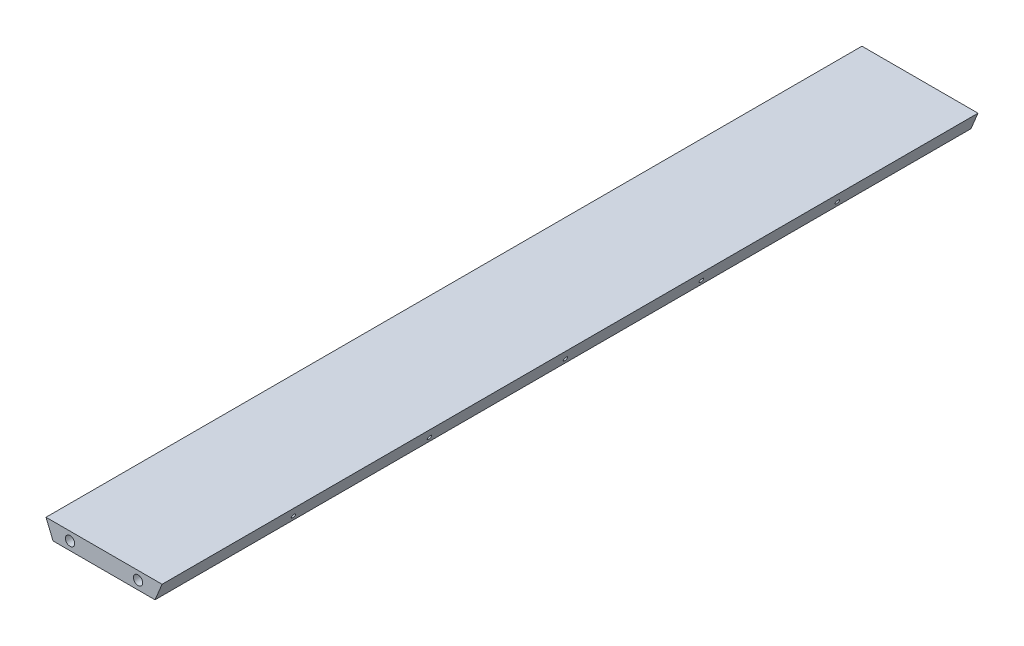
ISO-10303-21;
HEADER;
FILE_DESCRIPTION(('STEP AP214'),'2;1');
FILE_NAME('part.step','',(''),(''),'','','');
FILE_SCHEMA(('AUTOMOTIVE_DESIGN { 1 0 10303 214 1 1 1 1 }'));
ENDSEC;
DATA;
#1=APPLICATION_CONTEXT('core data for automotive mechanical design processes');
#2=APPLICATION_PROTOCOL_DEFINITION('international standard','automotive_design',2000,#1);
#3=PRODUCT_CONTEXT('',#1,'mechanical');
#4=PRODUCT('Part','Part','',(#3));
#5=PRODUCT_RELATED_PRODUCT_CATEGORY('part','',(#4));
#6=PRODUCT_DEFINITION_FORMATION('','',#4);
#7=PRODUCT_DEFINITION_CONTEXT('part definition',#1,'design');
#8=PRODUCT_DEFINITION('design','',#6,#7);
#9=PRODUCT_DEFINITION_SHAPE('','',#8);
#10=(LENGTH_UNIT() NAMED_UNIT(*) SI_UNIT(.MILLI.,.METRE.));
#11=(NAMED_UNIT(*) PLANE_ANGLE_UNIT() SI_UNIT($,.RADIAN.));
#12=(NAMED_UNIT(*) SI_UNIT($,.STERADIAN.) SOLID_ANGLE_UNIT());
#13=UNCERTAINTY_MEASURE_WITH_UNIT(LENGTH_MEASURE(1.E-05),#10,'distance_accuracy_value','');
#14=(GEOMETRIC_REPRESENTATION_CONTEXT(3) GLOBAL_UNCERTAINTY_ASSIGNED_CONTEXT((#13)) GLOBAL_UNIT_ASSIGNED_CONTEXT((#10,
#11,#12)) REPRESENTATION_CONTEXT('',''));
#15=CARTESIAN_POINT('',(0.,0.,0.));
#16=DIRECTION('',(0.,0.,1.));
#17=DIRECTION('',(1.,0.,0.));
#18=AXIS2_PLACEMENT_3D('',#15,#16,#17);
#19=CARTESIAN_POINT('',(19.05,45.9907683632075,304.8));
#20=DIRECTION('',(0.,1.,0.));
#21=DIRECTION('',(0.,0.,1.));
#22=AXIS2_PLACEMENT_3D('',#19,#20,#21);
#23=PLANE('',#22);
#24=DIRECTION('',(1.,0.,0.));
#25=VECTOR('',#24,1.);
#26=CARTESIAN_POINT('',(19.05,45.9907683632075,0.));
#27=LINE('',#26,#25);
#28=CARTESIAN_POINT('',(-19.05,45.9907683632075,0.));
#29=VERTEX_POINT('',#28);
#30=CARTESIAN_POINT('',(19.05,45.9907683632075,0.));
#31=VERTEX_POINT('',#30);
#32=EDGE_CURVE('E127',#29,#31,#27,.T.);
#33=ORIENTED_EDGE('',*,*,#32,.T.);
#34=DIRECTION('',(0.,0.,-1.));
#35=VECTOR('',#34,1.);
#36=CARTESIAN_POINT('',(19.05,45.9907683632075,304.8));
#37=LINE('',#36,#35);
#38=CARTESIAN_POINT('',(19.05,45.9907683632075,304.8));
#39=VERTEX_POINT('',#38);
#40=EDGE_CURVE('E11',#39,#31,#37,.T.);
#41=ORIENTED_EDGE('',*,*,#40,.F.);
#42=DIRECTION('',(1.,0.,0.));
#43=VECTOR('',#42,1.);
#44=CARTESIAN_POINT('',(19.05,45.9907683632075,304.8));
#45=LINE('',#44,#43);
#46=CARTESIAN_POINT('',(-19.05,45.9907683632075,304.8));
#47=VERTEX_POINT('',#46);
#48=EDGE_CURVE('E128',#47,#39,#45,.T.);
#49=ORIENTED_EDGE('',*,*,#48,.F.);
#50=DIRECTION('',(0.,0.,-1.));
#51=VECTOR('',#50,1.);
#52=CARTESIAN_POINT('',(-19.05,45.9907683632075,304.8));
#53=LINE('',#52,#51);
#54=EDGE_CURVE('E134',#47,#29,#53,.T.);
#55=ORIENTED_EDGE('',*,*,#54,.T.);
#56=EDGE_LOOP('',(#33,#41,#49,#55));
#57=FACE_BOUND('',#56,.T.);
#58=ADVANCED_FACE('F32',(#57),#23,.F.);
#59=CARTESIAN_POINT('',(21.6802561210692,52.3407683632075,304.8));
#60=DIRECTION('',(-0.923879532511287,0.38268343236509,0.));
#61=DIRECTION('',(-0.38268343236509,-0.923879532511287,0.));
#62=AXIS2_PLACEMENT_3D('',#59,#60,#61);
#63=PLANE('',#62);
#64=CARTESIAN_POINT('',(19.9612649233194,48.1907564999999,50.8));
#65=DIRECTION('',(0.923879532511287,-0.38268343236509,0.));
#66=DIRECTION('',(0.38268343236509,0.923879532511287,0.));
#67=AXIS2_PLACEMENT_3D('',#64,#65,#66);
#68=CIRCLE('',#67,0.79374999999992);
#69=CARTESIAN_POINT('',(20.2650198977592,48.9240858789307,50.8));
#70=VERTEX_POINT('',#69);
#71=EDGE_CURVE('E177',#70,#70,#68,.T.);
#72=ORIENTED_EDGE('',*,*,#71,.F.);
#73=EDGE_LOOP('',(#72));
#74=FACE_BOUND('',#73,.T.);
#75=CARTESIAN_POINT('',(19.9612649233194,48.1907564999999,101.6));
#76=DIRECTION('',(0.923879532511287,-0.38268343236509,0.));
#77=DIRECTION('',(0.38268343236509,0.923879532511287,0.));
#78=AXIS2_PLACEMENT_3D('',#75,#76,#77);
#79=CIRCLE('',#78,0.793749999999904);
#80=CARTESIAN_POINT('',(20.2650198977591,48.9240858789307,101.6));
#81=VERTEX_POINT('',#80);
#82=EDGE_CURVE('E181',#81,#81,#79,.T.);
#83=ORIENTED_EDGE('',*,*,#82,.F.);
#84=EDGE_LOOP('',(#83));
#85=FACE_BOUND('',#84,.T.);
#86=CARTESIAN_POINT('',(19.9612649233194,48.1907564999999,152.4));
#87=DIRECTION('',(0.923879532511287,-0.38268343236509,0.));
#88=DIRECTION('',(0.38268343236509,0.923879532511287,0.));
#89=AXIS2_PLACEMENT_3D('',#86,#87,#88);
#90=CIRCLE('',#89,0.793749999999904);
#91=CARTESIAN_POINT('',(20.2650198977591,48.9240858789307,152.4));
#92=VERTEX_POINT('',#91);
#93=EDGE_CURVE('E185',#92,#92,#90,.T.);
#94=ORIENTED_EDGE('',*,*,#93,.F.);
#95=EDGE_LOOP('',(#94));
#96=FACE_BOUND('',#95,.T.);
#97=CARTESIAN_POINT('',(19.9612649233194,48.1907564999999,203.2));
#98=DIRECTION('',(0.923879532511287,-0.38268343236509,0.));
#99=DIRECTION('',(0.38268343236509,0.923879532511287,0.));
#100=AXIS2_PLACEMENT_3D('',#97,#98,#99);
#101=CIRCLE('',#100,0.793749999999906);
#102=CARTESIAN_POINT('',(20.2650198977591,48.9240858789307,203.2));
#103=VERTEX_POINT('',#102);
#104=EDGE_CURVE('E189',#103,#103,#101,.T.);
#105=ORIENTED_EDGE('',*,*,#104,.F.);
#106=EDGE_LOOP('',(#105));
#107=FACE_BOUND('',#106,.T.);
#108=CARTESIAN_POINT('',(19.9612649233194,48.1907564999999,254.));
#109=DIRECTION('',(0.923879532511287,-0.38268343236509,0.));
#110=DIRECTION('',(0.38268343236509,0.923879532511287,0.));
#111=AXIS2_PLACEMENT_3D('',#108,#109,#110);
#112=CIRCLE('',#111,0.793749999999908);
#113=CARTESIAN_POINT('',(20.2650198977591,48.9240858789307,254.));
#114=VERTEX_POINT('',#113);
#115=EDGE_CURVE('E192',#114,#114,#112,.T.);
#116=ORIENTED_EDGE('',*,*,#115,.F.);
#117=EDGE_LOOP('',(#116));
#118=FACE_BOUND('',#117,.T.);
#119=DIRECTION('',(0.38268343236509,0.923879532511287,0.));
#120=VECTOR('',#119,1.);
#121=CARTESIAN_POINT('',(21.6802561210692,52.3407683632075,0.));
#122=LINE('',#121,#120);
#123=CARTESIAN_POINT('',(21.6802561210692,52.3407683632075,0.));
#124=VERTEX_POINT('',#123);
#125=EDGE_CURVE('E137',#31,#124,#122,.T.);
#126=ORIENTED_EDGE('',*,*,#125,.T.);
#127=DIRECTION('',(0.,0.,-1.));
#128=VECTOR('',#127,1.);
#129=CARTESIAN_POINT('',(21.6802561210692,52.3407683632075,304.8));
#130=LINE('',#129,#128);
#131=CARTESIAN_POINT('',(21.6802561210692,52.3407683632075,304.8));
#132=VERTEX_POINT('',#131);
#133=EDGE_CURVE('E40',#132,#124,#130,.T.);
#134=ORIENTED_EDGE('',*,*,#133,.F.);
#135=DIRECTION('',(0.38268343236509,0.923879532511287,0.));
#136=VECTOR('',#135,1.);
#137=CARTESIAN_POINT('',(21.6802561210692,52.3407683632075,304.8));
#138=LINE('',#137,#136);
#139=EDGE_CURVE('E79',#39,#132,#138,.T.);
#140=ORIENTED_EDGE('',*,*,#139,.F.);
#141=ORIENTED_EDGE('',*,*,#40,.T.);
#142=EDGE_LOOP('',(#126,#134,#140,#141));
#143=FACE_BOUND('',#142,.T.);
#144=ADVANCED_FACE('F162',(#74,#85,#96,#107,#118,#143),#63,.F.);
#145=CARTESIAN_POINT('',(-21.6802561210692,52.3407683632075,304.8));
#146=DIRECTION('',(0.,-1.,0.));
#147=DIRECTION('',(1.,0.,0.));
#148=AXIS2_PLACEMENT_3D('',#145,#146,#147);
#149=PLANE('',#148);
#150=DIRECTION('',(-1.,0.,0.));
#151=VECTOR('',#150,1.);
#152=CARTESIAN_POINT('',(-21.6802561210692,52.3407683632075,0.));
#153=LINE('',#152,#151);
#154=CARTESIAN_POINT('',(-21.6802561210692,52.3407683632075,0.));
#155=VERTEX_POINT('',#154);
#156=EDGE_CURVE('E66',#124,#155,#153,.T.);
#157=ORIENTED_EDGE('',*,*,#156,.T.);
#158=DIRECTION('',(0.,0.,-1.));
#159=VECTOR('',#158,1.);
#160=CARTESIAN_POINT('',(-21.6802561210692,52.3407683632075,304.8));
#161=LINE('',#160,#159);
#162=CARTESIAN_POINT('',(-21.6802561210692,52.3407683632075,304.8));
#163=VERTEX_POINT('',#162);
#164=EDGE_CURVE('E142',#163,#155,#161,.T.);
#165=ORIENTED_EDGE('',*,*,#164,.F.);
#166=DIRECTION('',(-1.,0.,0.));
#167=VECTOR('',#166,1.);
#168=CARTESIAN_POINT('',(-21.6802561210692,52.3407683632075,304.8));
#169=LINE('',#168,#167);
#170=EDGE_CURVE('E131',#132,#163,#169,.T.);
#171=ORIENTED_EDGE('',*,*,#170,.F.);
#172=ORIENTED_EDGE('',*,*,#133,.T.);
#173=EDGE_LOOP('',(#157,#165,#171,#172));
#174=FACE_BOUND('',#173,.T.);
#175=ADVANCED_FACE('F144',(#174),#149,.F.);
#176=CARTESIAN_POINT('',(-19.05,45.9907683632075,304.8));
#177=DIRECTION('',(0.923879532511287,0.38268343236509,0.));
#178=DIRECTION('',(-0.38268343236509,0.923879532511287,0.));
#179=AXIS2_PLACEMENT_3D('',#176,#177,#178);
#180=PLANE('',#179);
#181=CARTESIAN_POINT('',(-19.9612649233194,48.1907564999999,50.8));
#182=DIRECTION('',(0.923879532511287,0.38268343236509,0.));
#183=DIRECTION('',(-0.38268343236509,0.923879532511287,0.));
#184=AXIS2_PLACEMENT_3D('',#181,#182,#183);
#185=CIRCLE('',#184,0.79374999999992);
#186=CARTESIAN_POINT('',(-20.2650198977592,48.9240858789307,50.8));
#187=VERTEX_POINT('',#186);
#188=EDGE_CURVE('E238',#187,#187,#185,.T.);
#189=ORIENTED_EDGE('',*,*,#188,.T.);
#190=EDGE_LOOP('',(#189));
#191=FACE_BOUND('',#190,.T.);
#192=CARTESIAN_POINT('',(-19.9612649233194,48.1907564999999,101.6));
#193=DIRECTION('',(0.923879532511287,0.38268343236509,0.));
#194=DIRECTION('',(-0.38268343236509,0.923879532511287,0.));
#195=AXIS2_PLACEMENT_3D('',#192,#193,#194);
#196=CIRCLE('',#195,0.793749999999904);
#197=CARTESIAN_POINT('',(-20.2650198977591,48.9240858789307,101.6));
#198=VERTEX_POINT('',#197);
#199=EDGE_CURVE('E232',#198,#198,#196,.T.);
#200=ORIENTED_EDGE('',*,*,#199,.T.);
#201=EDGE_LOOP('',(#200));
#202=FACE_BOUND('',#201,.T.);
#203=CARTESIAN_POINT('',(-19.9612649233194,48.1907564999999,152.4));
#204=DIRECTION('',(0.923879532511287,0.38268343236509,0.));
#205=DIRECTION('',(-0.38268343236509,0.923879532511287,0.));
#206=AXIS2_PLACEMENT_3D('',#203,#204,#205);
#207=CIRCLE('',#206,0.793749999999904);
#208=CARTESIAN_POINT('',(-20.2650198977591,48.9240858789307,152.4));
#209=VERTEX_POINT('',#208);
#210=EDGE_CURVE('E226',#209,#209,#207,.T.);
#211=ORIENTED_EDGE('',*,*,#210,.T.);
#212=EDGE_LOOP('',(#211));
#213=FACE_BOUND('',#212,.T.);
#214=CARTESIAN_POINT('',(-19.9612649233194,48.1907564999999,203.2));
#215=DIRECTION('',(0.923879532511287,0.38268343236509,0.));
#216=DIRECTION('',(-0.38268343236509,0.923879532511287,0.));
#217=AXIS2_PLACEMENT_3D('',#214,#215,#216);
#218=CIRCLE('',#217,0.793749999999906);
#219=CARTESIAN_POINT('',(-20.2650198977591,48.9240858789307,203.2));
#220=VERTEX_POINT('',#219);
#221=EDGE_CURVE('E220',#220,#220,#218,.T.);
#222=ORIENTED_EDGE('',*,*,#221,.T.);
#223=EDGE_LOOP('',(#222));
#224=FACE_BOUND('',#223,.T.);
#225=CARTESIAN_POINT('',(-19.9612649233194,48.1907564999999,254.));
#226=DIRECTION('',(0.923879532511287,0.38268343236509,0.));
#227=DIRECTION('',(-0.38268343236509,0.923879532511287,0.));
#228=AXIS2_PLACEMENT_3D('',#225,#226,#227);
#229=CIRCLE('',#228,0.793749999999908);
#230=CARTESIAN_POINT('',(-20.2650198977591,48.9240858789307,254.));
#231=VERTEX_POINT('',#230);
#232=EDGE_CURVE('E214',#231,#231,#229,.T.);
#233=ORIENTED_EDGE('',*,*,#232,.T.);
#234=EDGE_LOOP('',(#233));
#235=FACE_BOUND('',#234,.T.);
#236=DIRECTION('',(0.38268343236509,-0.923879532511287,0.));
#237=VECTOR('',#236,1.);
#238=CARTESIAN_POINT('',(-19.05,45.9907683632075,0.));
#239=LINE('',#238,#237);
#240=EDGE_CURVE('E72',#155,#29,#239,.T.);
#241=ORIENTED_EDGE('',*,*,#240,.T.);
#242=ORIENTED_EDGE('',*,*,#54,.F.);
#243=DIRECTION('',(0.38268343236509,-0.923879532511287,0.));
#244=VECTOR('',#243,1.);
#245=CARTESIAN_POINT('',(-19.05,45.9907683632075,304.8));
#246=LINE('',#245,#244);
#247=EDGE_CURVE('E48',#163,#47,#246,.T.);
#248=ORIENTED_EDGE('',*,*,#247,.F.);
#249=ORIENTED_EDGE('',*,*,#164,.T.);
#250=EDGE_LOOP('',(#241,#242,#248,#249));
#251=FACE_BOUND('',#250,.T.);
#252=ADVANCED_FACE('F151',(#191,#202,#213,#224,#235,#251),#180,.F.);
#253=CARTESIAN_POINT('',(0.,0.,304.8));
#254=DIRECTION('',(0.,0.,-1.));
#255=DIRECTION('',(-1.,0.,0.));
#256=AXIS2_PLACEMENT_3D('',#253,#254,#255);
#257=PLANE('',#256);
#258=CARTESIAN_POINT('',(-12.7,49.1657683632075,304.8));
#259=DIRECTION('',(0.,0.,1.));
#260=DIRECTION('',(1.,0.,0.));
#261=AXIS2_PLACEMENT_3D('',#258,#259,#260);
#262=CIRCLE('',#261,1.72719999999999);
#263=CARTESIAN_POINT('',(-10.9728,49.1657683632075,304.8));
#264=VERTEX_POINT('',#263);
#265=EDGE_CURVE('E103',#264,#264,#262,.T.);
#266=ORIENTED_EDGE('',*,*,#265,.F.);
#267=EDGE_LOOP('',(#266));
#268=FACE_BOUND('',#267,.T.);
#269=CARTESIAN_POINT('',(12.7,49.1657683632075,304.8));
#270=DIRECTION('',(0.,0.,1.));
#271=DIRECTION('',(1.,0.,0.));
#272=AXIS2_PLACEMENT_3D('',#269,#270,#271);
#273=CIRCLE('',#272,1.72719999999999);
#274=CARTESIAN_POINT('',(14.4272,49.1657683632075,304.8));
#275=VERTEX_POINT('',#274);
#276=EDGE_CURVE('E102',#275,#275,#273,.T.);
#277=ORIENTED_EDGE('',*,*,#276,.F.);
#278=EDGE_LOOP('',(#277));
#279=FACE_BOUND('',#278,.T.);
#280=ORIENTED_EDGE('',*,*,#48,.T.);
#281=ORIENTED_EDGE('',*,*,#139,.T.);
#282=ORIENTED_EDGE('',*,*,#170,.T.);
#283=ORIENTED_EDGE('',*,*,#247,.T.);
#284=EDGE_LOOP('',(#280,#281,#282,#283));
#285=FACE_BOUND('',#284,.T.);
#286=ADVANCED_FACE('F153',(#268,#279,#285),#257,.F.);
#287=CARTESIAN_POINT('',(0.,0.,0.));
#288=DIRECTION('',(0.,0.,-1.));
#289=DIRECTION('',(-1.,0.,0.));
#290=AXIS2_PLACEMENT_3D('',#287,#288,#289);
#291=PLANE('',#290);
#292=CARTESIAN_POINT('',(-12.7,49.1657683632075,0.));
#293=DIRECTION('',(0.,0.,-1.));
#294=DIRECTION('',(-1.,0.,0.));
#295=AXIS2_PLACEMENT_3D('',#292,#293,#294);
#296=CIRCLE('',#295,1.72719999999999);
#297=CARTESIAN_POINT('',(-14.4272,49.1657683632075,0.));
#298=VERTEX_POINT('',#297);
#299=EDGE_CURVE('E115',#298,#298,#296,.T.);
#300=ORIENTED_EDGE('',*,*,#299,.F.);
#301=EDGE_LOOP('',(#300));
#302=FACE_BOUND('',#301,.T.);
#303=CARTESIAN_POINT('',(12.7,49.1657683632075,0.));
#304=DIRECTION('',(0.,0.,-1.));
#305=DIRECTION('',(-1.,0.,0.));
#306=AXIS2_PLACEMENT_3D('',#303,#304,#305);
#307=CIRCLE('',#306,1.72719999999999);
#308=CARTESIAN_POINT('',(10.9728,49.1657683632075,0.));
#309=VERTEX_POINT('',#308);
#310=EDGE_CURVE('E121',#309,#309,#307,.T.);
#311=ORIENTED_EDGE('',*,*,#310,.F.);
#312=EDGE_LOOP('',(#311));
#313=FACE_BOUND('',#312,.T.);
#314=ORIENTED_EDGE('',*,*,#32,.F.);
#315=ORIENTED_EDGE('',*,*,#240,.F.);
#316=ORIENTED_EDGE('',*,*,#156,.F.);
#317=ORIENTED_EDGE('',*,*,#125,.F.);
#318=EDGE_LOOP('',(#314,#315,#316,#317));
#319=FACE_BOUND('',#318,.T.);
#320=ADVANCED_FACE('F147',(#302,#313,#319),#291,.T.);
#321=CARTESIAN_POINT('',(12.7,49.1657683632075,25.4));
#322=DIRECTION('',(0.,0.,-1.));
#323=DIRECTION('',(-1.,0.,0.));
#324=AXIS2_PLACEMENT_3D('',#321,#322,#323);
#325=CONICAL_SURFACE('',#324,1.7272,1.02974425867665);
#326=CARTESIAN_POINT('',(12.7,49.1657683632075,26.4378064611844));
#327=VERTEX_POINT('',#326);
#328=VERTEX_LOOP('',#327);
#329=FACE_BOUND('',#328,.T.);
#330=CARTESIAN_POINT('',(12.7,49.1657683632075,25.4));
#331=DIRECTION('',(0.,0.,-1.));
#332=DIRECTION('',(-1.,0.,0.));
#333=AXIS2_PLACEMENT_3D('',#330,#331,#332);
#334=CIRCLE('',#333,1.7272);
#335=CARTESIAN_POINT('',(10.9728,49.1657683632075,25.4));
#336=VERTEX_POINT('',#335);
#337=EDGE_CURVE('E124',#336,#336,#334,.T.);
#338=ORIENTED_EDGE('',*,*,#337,.T.);
#339=EDGE_LOOP('',(#338));
#340=FACE_BOUND('',#339,.T.);
#341=ADVANCED_FACE('F346',(#329,#340),#325,.F.);
#342=CARTESIAN_POINT('',(12.7,49.1657683632075,0.));
#343=DIRECTION('',(0.,0.,-1.));
#344=DIRECTION('',(-1.,0.,0.));
#345=AXIS2_PLACEMENT_3D('',#342,#343,#344);
#346=CYLINDRICAL_SURFACE('',#345,1.72719999999999);
#347=ORIENTED_EDGE('',*,*,#337,.F.);
#348=EDGE_LOOP('',(#347));
#349=FACE_BOUND('',#348,.T.);
#350=ORIENTED_EDGE('',*,*,#310,.T.);
#351=EDGE_LOOP('',(#350));
#352=FACE_BOUND('',#351,.T.);
#353=ADVANCED_FACE('F342',(#349,#352),#346,.F.);
#354=CARTESIAN_POINT('',(-12.7,49.1657683632075,25.4));
#355=DIRECTION('',(0.,0.,-1.));
#356=DIRECTION('',(-1.,0.,0.));
#357=AXIS2_PLACEMENT_3D('',#354,#355,#356);
#358=CONICAL_SURFACE('',#357,1.7272,1.02974425867665);
#359=CARTESIAN_POINT('',(-12.7,49.1657683632075,26.4378064611844));
#360=VERTEX_POINT('',#359);
#361=VERTEX_LOOP('',#360);
#362=FACE_BOUND('',#361,.T.);
#363=CARTESIAN_POINT('',(-12.7,49.1657683632075,25.4));
#364=DIRECTION('',(0.,0.,-1.));
#365=DIRECTION('',(-1.,0.,0.));
#366=AXIS2_PLACEMENT_3D('',#363,#364,#365);
#367=CIRCLE('',#366,1.7272);
#368=CARTESIAN_POINT('',(-14.4272,49.1657683632075,25.4));
#369=VERTEX_POINT('',#368);
#370=EDGE_CURVE('E118',#369,#369,#367,.T.);
#371=ORIENTED_EDGE('',*,*,#370,.T.);
#372=EDGE_LOOP('',(#371));
#373=FACE_BOUND('',#372,.T.);
#374=ADVANCED_FACE('F338',(#362,#373),#358,.F.);
#375=CARTESIAN_POINT('',(-12.7,49.1657683632075,0.));
#376=DIRECTION('',(0.,0.,-1.));
#377=DIRECTION('',(-1.,0.,0.));
#378=AXIS2_PLACEMENT_3D('',#375,#376,#377);
#379=CYLINDRICAL_SURFACE('',#378,1.72719999999999);
#380=ORIENTED_EDGE('',*,*,#370,.F.);
#381=EDGE_LOOP('',(#380));
#382=FACE_BOUND('',#381,.T.);
#383=ORIENTED_EDGE('',*,*,#299,.T.);
#384=EDGE_LOOP('',(#383));
#385=FACE_BOUND('',#384,.T.);
#386=ADVANCED_FACE('F334',(#382,#385),#379,.F.);
#387=CARTESIAN_POINT('',(12.7,49.1657683632075,279.4));
#388=DIRECTION('',(0.,0.,1.));
#389=DIRECTION('',(1.,0.,0.));
#390=AXIS2_PLACEMENT_3D('',#387,#388,#389);
#391=CONICAL_SURFACE('',#390,1.7272,1.02974425867665);
#392=CARTESIAN_POINT('',(12.7,49.1657683632075,278.362193538816));
#393=VERTEX_POINT('',#392);
#394=VERTEX_LOOP('',#393);
#395=FACE_BOUND('',#394,.T.);
#396=CARTESIAN_POINT('',(12.7,49.1657683632075,279.4));
#397=DIRECTION('',(0.,0.,1.));
#398=DIRECTION('',(1.,0.,0.));
#399=AXIS2_PLACEMENT_3D('',#396,#397,#398);
#400=CIRCLE('',#399,1.7272);
#401=CARTESIAN_POINT('',(14.4272,49.1657683632075,279.4));
#402=VERTEX_POINT('',#401);
#403=EDGE_CURVE('E106',#402,#402,#400,.T.);
#404=ORIENTED_EDGE('',*,*,#403,.T.);
#405=EDGE_LOOP('',(#404));
#406=FACE_BOUND('',#405,.T.);
#407=ADVANCED_FACE('F330',(#395,#406),#391,.F.);
#408=CARTESIAN_POINT('',(12.7,49.1657683632075,304.8));
#409=DIRECTION('',(0.,0.,1.));
#410=DIRECTION('',(1.,0.,0.));
#411=AXIS2_PLACEMENT_3D('',#408,#409,#410);
#412=CYLINDRICAL_SURFACE('',#411,1.72719999999999);
#413=ORIENTED_EDGE('',*,*,#403,.F.);
#414=EDGE_LOOP('',(#413));
#415=FACE_BOUND('',#414,.T.);
#416=ORIENTED_EDGE('',*,*,#276,.T.);
#417=EDGE_LOOP('',(#416));
#418=FACE_BOUND('',#417,.T.);
#419=ADVANCED_FACE('F96',(#415,#418),#412,.F.);
#420=CARTESIAN_POINT('',(-12.7,49.1657683632075,279.4));
#421=DIRECTION('',(0.,0.,1.));
#422=DIRECTION('',(1.,0.,0.));
#423=AXIS2_PLACEMENT_3D('',#420,#421,#422);
#424=CONICAL_SURFACE('',#423,1.7272,1.02974425867665);
#425=CARTESIAN_POINT('',(-12.7,49.1657683632075,278.362193538816));
#426=VERTEX_POINT('',#425);
#427=VERTEX_LOOP('',#426);
#428=FACE_BOUND('',#427,.T.);
#429=CARTESIAN_POINT('',(-12.7,49.1657683632075,279.4));
#430=DIRECTION('',(0.,0.,1.));
#431=DIRECTION('',(1.,0.,0.));
#432=AXIS2_PLACEMENT_3D('',#429,#430,#431);
#433=CIRCLE('',#432,1.7272);
#434=CARTESIAN_POINT('',(-10.9728,49.1657683632075,279.4));
#435=VERTEX_POINT('',#434);
#436=EDGE_CURVE('E100',#435,#435,#433,.T.);
#437=ORIENTED_EDGE('',*,*,#436,.T.);
#438=EDGE_LOOP('',(#437));
#439=FACE_BOUND('',#438,.T.);
#440=ADVANCED_FACE('F92',(#428,#439),#424,.F.);
#441=CARTESIAN_POINT('',(-12.7,49.1657683632075,304.8));
#442=DIRECTION('',(0.,0.,1.));
#443=DIRECTION('',(1.,0.,0.));
#444=AXIS2_PLACEMENT_3D('',#441,#442,#443);
#445=CYLINDRICAL_SURFACE('',#444,1.72719999999999);
#446=ORIENTED_EDGE('',*,*,#436,.F.);
#447=EDGE_LOOP('',(#446));
#448=FACE_BOUND('',#447,.T.);
#449=ORIENTED_EDGE('',*,*,#265,.T.);
#450=EDGE_LOOP('',(#449));
#451=FACE_BOUND('',#450,.T.);
#452=ADVANCED_FACE('F95',(#448,#451),#445,.F.);
#453=CARTESIAN_POINT('',(14.0946298918727,50.6207962955183,254.));
#454=DIRECTION('',(0.923879532511287,-0.38268343236509,0.));
#455=DIRECTION('',(0.38268343236509,0.923879532511287,0.));
#456=AXIS2_PLACEMENT_3D('',#453,#454,#455);
#457=CYLINDRICAL_SURFACE('',#456,0.793749999999908);
#458=CARTESIAN_POINT('',(14.0946298918727,50.6207962955183,254.));
#459=DIRECTION('',(0.923879532511287,-0.38268343236509,0.));
#460=DIRECTION('',(0.38268343236509,0.923879532511287,0.));
#461=AXIS2_PLACEMENT_3D('',#458,#459,#460);
#462=CIRCLE('',#461,0.793749999999908);
#463=CARTESIAN_POINT('',(14.3983848663124,51.354125674449,254.));
#464=VERTEX_POINT('',#463);
#465=EDGE_CURVE('E109',#464,#464,#462,.T.);
#466=ORIENTED_EDGE('',*,*,#465,.F.);
#467=EDGE_LOOP('',(#466));
#468=FACE_BOUND('',#467,.T.);
#469=ORIENTED_EDGE('',*,*,#115,.T.);
#470=EDGE_LOOP('',(#469));
#471=FACE_BOUND('',#470,.T.);
#472=ADVANCED_FACE('F321',(#468,#471),#457,.F.);
#473=CARTESIAN_POINT('',(14.0946298918727,50.6207962955183,254.));
#474=DIRECTION('',(0.923879532511287,-0.38268343236509,0.));
#475=DIRECTION('',(0.38268343236509,0.923879532511287,0.));
#476=AXIS2_PLACEMENT_3D('',#473,#474,#475);
#477=PLANE('',#476);
#478=ORIENTED_EDGE('',*,*,#465,.T.);
#479=EDGE_LOOP('',(#478));
#480=FACE_BOUND('',#479,.T.);
#481=ADVANCED_FACE('F317',(#480),#477,.T.);
#482=CARTESIAN_POINT('',(14.0946298918727,50.6207962955183,203.2));
#483=DIRECTION('',(0.923879532511287,-0.38268343236509,0.));
#484=DIRECTION('',(0.38268343236509,0.923879532511287,0.));
#485=AXIS2_PLACEMENT_3D('',#482,#483,#484);
#486=CYLINDRICAL_SURFACE('',#485,0.793749999999906);
#487=CARTESIAN_POINT('',(14.0946298918727,50.6207962955183,203.2));
#488=DIRECTION('',(0.923879532511287,-0.38268343236509,0.));
#489=DIRECTION('',(0.38268343236509,0.923879532511287,0.));
#490=AXIS2_PLACEMENT_3D('',#487,#488,#489);
#491=CIRCLE('',#490,0.793749999999906);
#492=CARTESIAN_POINT('',(14.3983848663124,51.354125674449,203.2));
#493=VERTEX_POINT('',#492);
#494=EDGE_CURVE('E194',#493,#493,#491,.T.);
#495=ORIENTED_EDGE('',*,*,#494,.F.);
#496=EDGE_LOOP('',(#495));
#497=FACE_BOUND('',#496,.T.);
#498=ORIENTED_EDGE('',*,*,#104,.T.);
#499=EDGE_LOOP('',(#498));
#500=FACE_BOUND('',#499,.T.);
#501=ADVANCED_FACE('F313',(#497,#500),#486,.F.);
#502=CARTESIAN_POINT('',(14.0946298918727,50.6207962955183,203.2));
#503=DIRECTION('',(0.923879532511287,-0.38268343236509,0.));
#504=DIRECTION('',(0.38268343236509,0.923879532511287,0.));
#505=AXIS2_PLACEMENT_3D('',#502,#503,#504);
#506=PLANE('',#505);
#507=ORIENTED_EDGE('',*,*,#494,.T.);
#508=EDGE_LOOP('',(#507));
#509=FACE_BOUND('',#508,.T.);
#510=ADVANCED_FACE('F309',(#509),#506,.T.);
#511=CARTESIAN_POINT('',(14.0946298918727,50.6207962955183,152.4));
#512=DIRECTION('',(0.923879532511287,-0.38268343236509,0.));
#513=DIRECTION('',(0.38268343236509,0.923879532511287,0.));
#514=AXIS2_PLACEMENT_3D('',#511,#512,#513);
#515=CYLINDRICAL_SURFACE('',#514,0.793749999999904);
#516=CARTESIAN_POINT('',(14.0946298918727,50.6207962955183,152.4));
#517=DIRECTION('',(0.923879532511287,-0.38268343236509,0.));
#518=DIRECTION('',(0.38268343236509,0.923879532511287,0.));
#519=AXIS2_PLACEMENT_3D('',#516,#517,#518);
#520=CIRCLE('',#519,0.793749999999904);
#521=CARTESIAN_POINT('',(14.3983848663124,51.354125674449,152.4));
#522=VERTEX_POINT('',#521);
#523=EDGE_CURVE('E200',#522,#522,#520,.T.);
#524=ORIENTED_EDGE('',*,*,#523,.F.);
#525=EDGE_LOOP('',(#524));
#526=FACE_BOUND('',#525,.T.);
#527=ORIENTED_EDGE('',*,*,#93,.T.);
#528=EDGE_LOOP('',(#527));
#529=FACE_BOUND('',#528,.T.);
#530=ADVANCED_FACE('F305',(#526,#529),#515,.F.);
#531=CARTESIAN_POINT('',(14.0946298918727,50.6207962955183,152.4));
#532=DIRECTION('',(0.923879532511287,-0.38268343236509,0.));
#533=DIRECTION('',(0.38268343236509,0.923879532511287,0.));
#534=AXIS2_PLACEMENT_3D('',#531,#532,#533);
#535=PLANE('',#534);
#536=ORIENTED_EDGE('',*,*,#523,.T.);
#537=EDGE_LOOP('',(#536));
#538=FACE_BOUND('',#537,.T.);
#539=ADVANCED_FACE('F301',(#538),#535,.T.);
#540=CARTESIAN_POINT('',(14.0946298918727,50.6207962955183,101.6));
#541=DIRECTION('',(0.923879532511287,-0.38268343236509,0.));
#542=DIRECTION('',(0.38268343236509,0.923879532511287,0.));
#543=AXIS2_PLACEMENT_3D('',#540,#541,#542);
#544=CYLINDRICAL_SURFACE('',#543,0.793749999999904);
#545=CARTESIAN_POINT('',(14.0946298918727,50.6207962955183,101.6));
#546=DIRECTION('',(0.923879532511287,-0.38268343236509,0.));
#547=DIRECTION('',(0.38268343236509,0.923879532511287,0.));
#548=AXIS2_PLACEMENT_3D('',#545,#546,#547);
#549=CIRCLE('',#548,0.793749999999904);
#550=CARTESIAN_POINT('',(14.3983848663124,51.354125674449,101.6));
#551=VERTEX_POINT('',#550);
#552=EDGE_CURVE('E203',#551,#551,#549,.T.);
#553=ORIENTED_EDGE('',*,*,#552,.F.);
#554=EDGE_LOOP('',(#553));
#555=FACE_BOUND('',#554,.T.);
#556=ORIENTED_EDGE('',*,*,#82,.T.);
#557=EDGE_LOOP('',(#556));
#558=FACE_BOUND('',#557,.T.);
#559=ADVANCED_FACE('F297',(#555,#558),#544,.F.);
#560=CARTESIAN_POINT('',(14.0946298918727,50.6207962955183,101.6));
#561=DIRECTION('',(0.923879532511287,-0.38268343236509,0.));
#562=DIRECTION('',(0.38268343236509,0.923879532511287,0.));
#563=AXIS2_PLACEMENT_3D('',#560,#561,#562);
#564=PLANE('',#563);
#565=ORIENTED_EDGE('',*,*,#552,.T.);
#566=EDGE_LOOP('',(#565));
#567=FACE_BOUND('',#566,.T.);
#568=ADVANCED_FACE('F293',(#567),#564,.T.);
#569=CARTESIAN_POINT('',(14.0946298918727,50.6207962955183,50.8));
#570=DIRECTION('',(0.923879532511287,-0.38268343236509,0.));
#571=DIRECTION('',(0.38268343236509,0.923879532511287,0.));
#572=AXIS2_PLACEMENT_3D('',#569,#570,#571);
#573=CYLINDRICAL_SURFACE('',#572,0.79374999999992);
#574=CARTESIAN_POINT('',(14.0946298918727,50.6207962955183,50.8));
#575=DIRECTION('',(0.923879532511287,-0.38268343236509,0.));
#576=DIRECTION('',(0.38268343236509,0.923879532511287,0.));
#577=AXIS2_PLACEMENT_3D('',#574,#575,#576);
#578=CIRCLE('',#577,0.79374999999992);
#579=CARTESIAN_POINT('',(14.3983848663125,51.354125674449,50.8));
#580=VERTEX_POINT('',#579);
#581=EDGE_CURVE('E207',#580,#580,#578,.T.);
#582=ORIENTED_EDGE('',*,*,#581,.F.);
#583=EDGE_LOOP('',(#582));
#584=FACE_BOUND('',#583,.T.);
#585=ORIENTED_EDGE('',*,*,#71,.T.);
#586=EDGE_LOOP('',(#585));
#587=FACE_BOUND('',#586,.T.);
#588=ADVANCED_FACE('F289',(#584,#587),#573,.F.);
#589=CARTESIAN_POINT('',(14.0946298918727,50.6207962955183,50.8));
#590=DIRECTION('',(0.923879532511287,-0.38268343236509,0.));
#591=DIRECTION('',(0.38268343236509,0.923879532511287,0.));
#592=AXIS2_PLACEMENT_3D('',#589,#590,#591);
#593=PLANE('',#592);
#594=ORIENTED_EDGE('',*,*,#581,.T.);
#595=EDGE_LOOP('',(#594));
#596=FACE_BOUND('',#595,.T.);
#597=ADVANCED_FACE('F285',(#596),#593,.T.);
#598=CARTESIAN_POINT('',(-14.0946298918727,50.6207962955183,254.));
#599=DIRECTION('',(-0.923879532511287,-0.38268343236509,0.));
#600=DIRECTION('',(0.38268343236509,-0.923879532511287,0.));
#601=AXIS2_PLACEMENT_3D('',#598,#599,#600);
#602=CYLINDRICAL_SURFACE('',#601,0.793749999999908);
#603=CARTESIAN_POINT('',(-14.0946298918727,50.6207962955183,254.));
#604=DIRECTION('',(0.923879532511287,0.38268343236509,0.));
#605=DIRECTION('',(-0.38268343236509,0.923879532511287,0.));
#606=AXIS2_PLACEMENT_3D('',#603,#604,#605);
#607=CIRCLE('',#606,0.793749999999908);
#608=CARTESIAN_POINT('',(-14.3983848663124,51.354125674449,254.));
#609=VERTEX_POINT('',#608);
#610=EDGE_CURVE('E211',#609,#609,#607,.T.);
#611=ORIENTED_EDGE('',*,*,#610,.T.);
#612=EDGE_LOOP('',(#611));
#613=FACE_BOUND('',#612,.T.);
#614=ORIENTED_EDGE('',*,*,#232,.F.);
#615=EDGE_LOOP('',(#614));
#616=FACE_BOUND('',#615,.T.);
#617=ADVANCED_FACE('F281',(#613,#616),#602,.F.);
#618=CARTESIAN_POINT('',(-14.0946298918727,50.6207962955183,254.));
#619=DIRECTION('',(-0.923879532511287,-0.38268343236509,0.));
#620=DIRECTION('',(-0.38268343236509,0.923879532511287,0.));
#621=AXIS2_PLACEMENT_3D('',#618,#619,#620);
#622=PLANE('',#621);
#623=ORIENTED_EDGE('',*,*,#610,.F.);
#624=EDGE_LOOP('',(#623));
#625=FACE_BOUND('',#624,.T.);
#626=ADVANCED_FACE('F277',(#625),#622,.T.);
#627=CARTESIAN_POINT('',(-14.0946298918727,50.6207962955183,203.2));
#628=DIRECTION('',(-0.923879532511287,-0.38268343236509,0.));
#629=DIRECTION('',(0.38268343236509,-0.923879532511287,0.));
#630=AXIS2_PLACEMENT_3D('',#627,#628,#629);
#631=CYLINDRICAL_SURFACE('',#630,0.793749999999906);
#632=CARTESIAN_POINT('',(-14.0946298918727,50.6207962955183,203.2));
#633=DIRECTION('',(0.923879532511287,0.38268343236509,0.));
#634=DIRECTION('',(-0.38268343236509,0.923879532511287,0.));
#635=AXIS2_PLACEMENT_3D('',#632,#633,#634);
#636=CIRCLE('',#635,0.793749999999906);
#637=CARTESIAN_POINT('',(-14.3983848663124,51.354125674449,203.2));
#638=VERTEX_POINT('',#637);
#639=EDGE_CURVE('E217',#638,#638,#636,.T.);
#640=ORIENTED_EDGE('',*,*,#639,.T.);
#641=EDGE_LOOP('',(#640));
#642=FACE_BOUND('',#641,.T.);
#643=ORIENTED_EDGE('',*,*,#221,.F.);
#644=EDGE_LOOP('',(#643));
#645=FACE_BOUND('',#644,.T.);
#646=ADVANCED_FACE('F273',(#642,#645),#631,.F.);
#647=CARTESIAN_POINT('',(-14.0946298918727,50.6207962955183,203.2));
#648=DIRECTION('',(-0.923879532511287,-0.38268343236509,0.));
#649=DIRECTION('',(-0.38268343236509,0.923879532511287,0.));
#650=AXIS2_PLACEMENT_3D('',#647,#648,#649);
#651=PLANE('',#650);
#652=ORIENTED_EDGE('',*,*,#639,.F.);
#653=EDGE_LOOP('',(#652));
#654=FACE_BOUND('',#653,.T.);
#655=ADVANCED_FACE('F269',(#654),#651,.T.);
#656=CARTESIAN_POINT('',(-14.0946298918727,50.6207962955183,152.4));
#657=DIRECTION('',(-0.923879532511287,-0.38268343236509,0.));
#658=DIRECTION('',(0.38268343236509,-0.923879532511287,0.));
#659=AXIS2_PLACEMENT_3D('',#656,#657,#658);
#660=CYLINDRICAL_SURFACE('',#659,0.793749999999904);
#661=CARTESIAN_POINT('',(-14.0946298918727,50.6207962955183,152.4));
#662=DIRECTION('',(0.923879532511287,0.38268343236509,0.));
#663=DIRECTION('',(-0.38268343236509,0.923879532511287,0.));
#664=AXIS2_PLACEMENT_3D('',#661,#662,#663);
#665=CIRCLE('',#664,0.793749999999904);
#666=CARTESIAN_POINT('',(-14.3983848663124,51.354125674449,152.4));
#667=VERTEX_POINT('',#666);
#668=EDGE_CURVE('E223',#667,#667,#665,.T.);
#669=ORIENTED_EDGE('',*,*,#668,.T.);
#670=EDGE_LOOP('',(#669));
#671=FACE_BOUND('',#670,.T.);
#672=ORIENTED_EDGE('',*,*,#210,.F.);
#673=EDGE_LOOP('',(#672));
#674=FACE_BOUND('',#673,.T.);
#675=ADVANCED_FACE('F265',(#671,#674),#660,.F.);
#676=CARTESIAN_POINT('',(-14.0946298918727,50.6207962955183,152.4));
#677=DIRECTION('',(-0.923879532511287,-0.38268343236509,0.));
#678=DIRECTION('',(-0.38268343236509,0.923879532511287,0.));
#679=AXIS2_PLACEMENT_3D('',#676,#677,#678);
#680=PLANE('',#679);
#681=ORIENTED_EDGE('',*,*,#668,.F.);
#682=EDGE_LOOP('',(#681));
#683=FACE_BOUND('',#682,.T.);
#684=ADVANCED_FACE('F261',(#683),#680,.T.);
#685=CARTESIAN_POINT('',(-14.0946298918727,50.6207962955183,101.6));
#686=DIRECTION('',(-0.923879532511287,-0.38268343236509,0.));
#687=DIRECTION('',(0.38268343236509,-0.923879532511287,0.));
#688=AXIS2_PLACEMENT_3D('',#685,#686,#687);
#689=CYLINDRICAL_SURFACE('',#688,0.793749999999904);
#690=CARTESIAN_POINT('',(-14.0946298918727,50.6207962955183,101.6));
#691=DIRECTION('',(0.923879532511287,0.38268343236509,0.));
#692=DIRECTION('',(-0.38268343236509,0.923879532511287,0.));
#693=AXIS2_PLACEMENT_3D('',#690,#691,#692);
#694=CIRCLE('',#693,0.793749999999904);
#695=CARTESIAN_POINT('',(-14.3983848663124,51.354125674449,101.6));
#696=VERTEX_POINT('',#695);
#697=EDGE_CURVE('E229',#696,#696,#694,.T.);
#698=ORIENTED_EDGE('',*,*,#697,.T.);
#699=EDGE_LOOP('',(#698));
#700=FACE_BOUND('',#699,.T.);
#701=ORIENTED_EDGE('',*,*,#199,.F.);
#702=EDGE_LOOP('',(#701));
#703=FACE_BOUND('',#702,.T.);
#704=ADVANCED_FACE('F257',(#700,#703),#689,.F.);
#705=CARTESIAN_POINT('',(-14.0946298918727,50.6207962955183,101.6));
#706=DIRECTION('',(-0.923879532511287,-0.38268343236509,0.));
#707=DIRECTION('',(-0.38268343236509,0.923879532511287,0.));
#708=AXIS2_PLACEMENT_3D('',#705,#706,#707);
#709=PLANE('',#708);
#710=ORIENTED_EDGE('',*,*,#697,.F.);
#711=EDGE_LOOP('',(#710));
#712=FACE_BOUND('',#711,.T.);
#713=ADVANCED_FACE('F252',(#712),#709,.T.);
#714=CARTESIAN_POINT('',(-14.0946298918727,50.6207962955183,50.8));
#715=DIRECTION('',(-0.923879532511287,-0.38268343236509,0.));
#716=DIRECTION('',(0.38268343236509,-0.923879532511287,0.));
#717=AXIS2_PLACEMENT_3D('',#714,#715,#716);
#718=CYLINDRICAL_SURFACE('',#717,0.79374999999992);
#719=CARTESIAN_POINT('',(-14.0946298918727,50.6207962955183,50.8));
#720=DIRECTION('',(0.923879532511287,0.38268343236509,0.));
#721=DIRECTION('',(-0.38268343236509,0.923879532511287,0.));
#722=AXIS2_PLACEMENT_3D('',#719,#720,#721);
#723=CIRCLE('',#722,0.79374999999992);
#724=CARTESIAN_POINT('',(-14.3983848663125,51.354125674449,50.8));
#725=VERTEX_POINT('',#724);
#726=EDGE_CURVE('E235',#725,#725,#723,.T.);
#727=ORIENTED_EDGE('',*,*,#726,.T.);
#728=EDGE_LOOP('',(#727));
#729=FACE_BOUND('',#728,.T.);
#730=ORIENTED_EDGE('',*,*,#188,.F.);
#731=EDGE_LOOP('',(#730));
#732=FACE_BOUND('',#731,.T.);
#733=ADVANCED_FACE('F243',(#729,#732),#718,.F.);
#734=CARTESIAN_POINT('',(-14.0946298918727,50.6207962955183,50.8));
#735=DIRECTION('',(-0.923879532511287,-0.38268343236509,0.));
#736=DIRECTION('',(-0.38268343236509,0.923879532511287,0.));
#737=AXIS2_PLACEMENT_3D('',#734,#735,#736);
#738=PLANE('',#737);
#739=ORIENTED_EDGE('',*,*,#726,.F.);
#740=EDGE_LOOP('',(#739));
#741=FACE_BOUND('',#740,.T.);
#742=ADVANCED_FACE('F246',(#741),#738,.T.);
#743=CLOSED_SHELL('',(#58,#144,#175,#252,#286,#320,#341,#353,#374,#386,#407,#419,#440,#452,#472,
#481,#501,#510,#530,#539,#559,#568,#588,#597,#617,#626,#646,#655,#675,#684,#704,#713,#733,#742));
#744=MANIFOLD_SOLID_BREP('B2',#743);
#745=ADVANCED_BREP_SHAPE_REPRESENTATION('',(#18,#744),#14);
#746=SHAPE_DEFINITION_REPRESENTATION(#9,#745);
ENDSEC;
END-ISO-10303-21;
